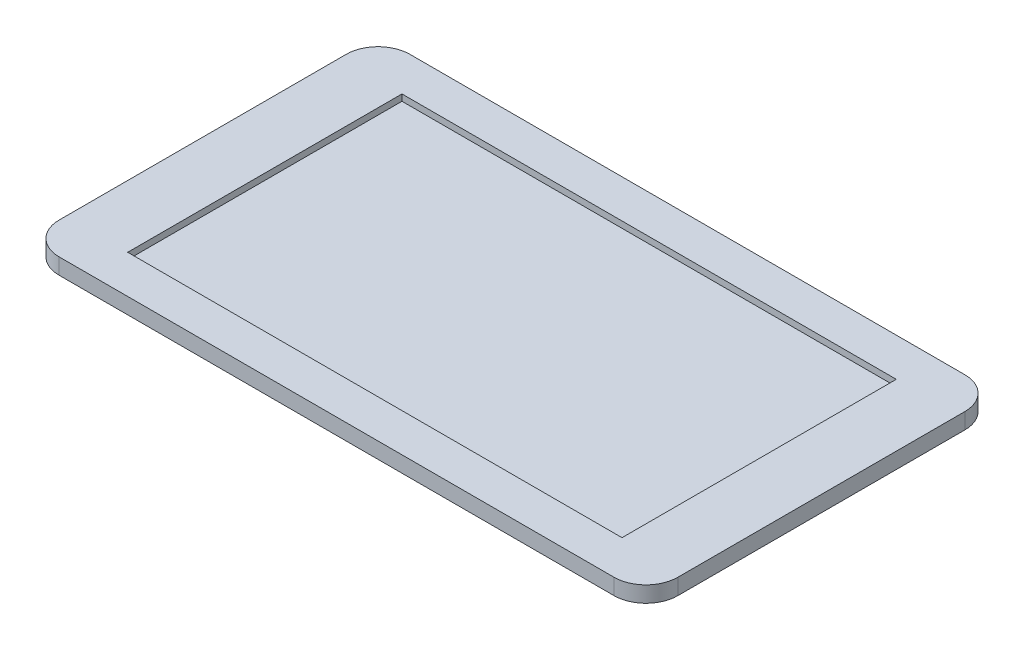
ISO-10303-21;
HEADER;
FILE_DESCRIPTION(('STEP AP214'),'2;1');
FILE_NAME('part.step','',(''),(''),'','','');
FILE_SCHEMA(('AUTOMOTIVE_DESIGN { 1 0 10303 214 1 1 1 1 }'));
ENDSEC;
DATA;
#1=APPLICATION_CONTEXT('core data for automotive mechanical design processes');
#2=APPLICATION_PROTOCOL_DEFINITION('international standard','automotive_design',2000,#1);
#3=PRODUCT_CONTEXT('',#1,'mechanical');
#4=PRODUCT('Part','Part','',(#3));
#5=PRODUCT_RELATED_PRODUCT_CATEGORY('part','',(#4));
#6=PRODUCT_DEFINITION_FORMATION('','',#4);
#7=PRODUCT_DEFINITION_CONTEXT('part definition',#1,'design');
#8=PRODUCT_DEFINITION('design','',#6,#7);
#9=PRODUCT_DEFINITION_SHAPE('','',#8);
#10=(LENGTH_UNIT() NAMED_UNIT(*) SI_UNIT(.MILLI.,.METRE.));
#11=(NAMED_UNIT(*) PLANE_ANGLE_UNIT() SI_UNIT($,.RADIAN.));
#12=(NAMED_UNIT(*) SI_UNIT($,.STERADIAN.) SOLID_ANGLE_UNIT());
#13=UNCERTAINTY_MEASURE_WITH_UNIT(LENGTH_MEASURE(1.E-05),#10,'distance_accuracy_value','');
#14=(GEOMETRIC_REPRESENTATION_CONTEXT(3) GLOBAL_UNCERTAINTY_ASSIGNED_CONTEXT((#13)) GLOBAL_UNIT_ASSIGNED_CONTEXT((#10,
#11,#12)) REPRESENTATION_CONTEXT('',''));
#15=CARTESIAN_POINT('',(0.,0.,0.));
#16=DIRECTION('',(0.,0.,1.));
#17=DIRECTION('',(1.,0.,0.));
#18=AXIS2_PLACEMENT_3D('',#15,#16,#17);
#19=CARTESIAN_POINT('',(97.,-5.,55.));
#20=DIRECTION('',(1.,0.,0.));
#21=DIRECTION('',(0.,0.,-1.));
#22=AXIS2_PLACEMENT_3D('',#19,#20,#21);
#23=PLANE('',#22);
#24=DIRECTION('',(0.,0.,-1.));
#25=VECTOR('',#24,1.);
#26=CARTESIAN_POINT('',(97.,0.,55.));
#27=LINE('',#26,#25);
#28=CARTESIAN_POINT('',(97.,0.,45.));
#29=VERTEX_POINT('',#28);
#30=CARTESIAN_POINT('',(97.,0.,-45.));
#31=VERTEX_POINT('',#30);
#32=EDGE_CURVE('E217',#29,#31,#27,.T.);
#33=ORIENTED_EDGE('',*,*,#32,.F.);
#34=DIRECTION('',(0.,1.,0.));
#35=VECTOR('',#34,1.);
#36=CARTESIAN_POINT('',(97.,-5.,45.));
#37=LINE('',#36,#35);
#38=CARTESIAN_POINT('',(97.,-5.,45.));
#39=VERTEX_POINT('',#38);
#40=EDGE_CURVE('E281',#29,#39,#37,.F.);
#41=ORIENTED_EDGE('',*,*,#40,.T.);
#42=DIRECTION('',(0.,0.,-1.));
#43=VECTOR('',#42,1.);
#44=CARTESIAN_POINT('',(97.,-5.,55.));
#45=LINE('',#44,#43);
#46=CARTESIAN_POINT('',(97.,-5.,-45.));
#47=VERTEX_POINT('',#46);
#48=EDGE_CURVE('E227',#39,#47,#45,.T.);
#49=ORIENTED_EDGE('',*,*,#48,.T.);
#50=DIRECTION('',(0.,1.,0.));
#51=VECTOR('',#50,1.);
#52=CARTESIAN_POINT('',(97.,-5.,-45.));
#53=LINE('',#52,#51);
#54=EDGE_CURVE('E277',#47,#31,#53,.T.);
#55=ORIENTED_EDGE('',*,*,#54,.T.);
#56=EDGE_LOOP('',(#33,#41,#49,#55));
#57=FACE_BOUND('',#56,.T.);
#58=ADVANCED_FACE('F39',(#57),#23,.T.);
#59=CARTESIAN_POINT('',(-97.,-5.,55.));
#60=DIRECTION('',(0.,0.,1.));
#61=DIRECTION('',(1.,0.,0.));
#62=AXIS2_PLACEMENT_3D('',#59,#60,#61);
#63=PLANE('',#62);
#64=DIRECTION('',(1.,0.,0.));
#65=VECTOR('',#64,1.);
#66=CARTESIAN_POINT('',(-97.,-5.,55.));
#67=LINE('',#66,#65);
#68=CARTESIAN_POINT('',(-87.,-5.,55.));
#69=VERTEX_POINT('',#68);
#70=CARTESIAN_POINT('',(87.,-5.,55.));
#71=VERTEX_POINT('',#70);
#72=EDGE_CURVE('E240',#69,#71,#67,.T.);
#73=ORIENTED_EDGE('',*,*,#72,.T.);
#74=DIRECTION('',(0.,1.,0.));
#75=VECTOR('',#74,1.);
#76=CARTESIAN_POINT('',(87.,-5.,55.));
#77=LINE('',#76,#75);
#78=CARTESIAN_POINT('',(87.,0.,55.));
#79=VERTEX_POINT('',#78);
#80=EDGE_CURVE('E261',#71,#79,#77,.T.);
#81=ORIENTED_EDGE('',*,*,#80,.T.);
#82=DIRECTION('',(1.,0.,0.));
#83=VECTOR('',#82,1.);
#84=CARTESIAN_POINT('',(-97.,0.,55.));
#85=LINE('',#84,#83);
#86=CARTESIAN_POINT('',(-87.,0.,55.));
#87=VERTEX_POINT('',#86);
#88=EDGE_CURVE('E232',#87,#79,#85,.T.);
#89=ORIENTED_EDGE('',*,*,#88,.F.);
#90=DIRECTION('',(0.,1.,0.));
#91=VECTOR('',#90,1.);
#92=CARTESIAN_POINT('',(-87.,-5.,55.));
#93=LINE('',#92,#91);
#94=EDGE_CURVE('E244',#87,#69,#93,.F.);
#95=ORIENTED_EDGE('',*,*,#94,.T.);
#96=EDGE_LOOP('',(#73,#81,#89,#95));
#97=FACE_BOUND('',#96,.T.);
#98=ADVANCED_FACE('F339',(#97),#63,.T.);
#99=CARTESIAN_POINT('',(-97.,-5.,55.));
#100=DIRECTION('',(-1.,0.,0.));
#101=DIRECTION('',(0.,0.,1.));
#102=AXIS2_PLACEMENT_3D('',#99,#100,#101);
#103=PLANE('',#102);
#104=DIRECTION('',(0.,0.,1.));
#105=VECTOR('',#104,1.);
#106=CARTESIAN_POINT('',(-97.,0.,55.));
#107=LINE('',#106,#105);
#108=CARTESIAN_POINT('',(-97.,0.,-45.));
#109=VERTEX_POINT('',#108);
#110=CARTESIAN_POINT('',(-97.,0.,45.));
#111=VERTEX_POINT('',#110);
#112=EDGE_CURVE('E252',#109,#111,#107,.T.);
#113=ORIENTED_EDGE('',*,*,#112,.F.);
#114=DIRECTION('',(0.,1.,0.));
#115=VECTOR('',#114,1.);
#116=CARTESIAN_POINT('',(-97.,-5.,-45.));
#117=LINE('',#116,#115);
#118=CARTESIAN_POINT('',(-97.,-5.,-45.));
#119=VERTEX_POINT('',#118);
#120=EDGE_CURVE('E11',#109,#119,#117,.F.);
#121=ORIENTED_EDGE('',*,*,#120,.T.);
#122=DIRECTION('',(0.,0.,1.));
#123=VECTOR('',#122,1.);
#124=CARTESIAN_POINT('',(-97.,-5.,55.));
#125=LINE('',#124,#123);
#126=CARTESIAN_POINT('',(-97.,-5.,45.));
#127=VERTEX_POINT('',#126);
#128=EDGE_CURVE('E236',#119,#127,#125,.T.);
#129=ORIENTED_EDGE('',*,*,#128,.T.);
#130=DIRECTION('',(0.,1.,0.));
#131=VECTOR('',#130,1.);
#132=CARTESIAN_POINT('',(-97.,-5.,45.));
#133=LINE('',#132,#131);
#134=EDGE_CURVE('E48',#127,#111,#133,.T.);
#135=ORIENTED_EDGE('',*,*,#134,.T.);
#136=EDGE_LOOP('',(#113,#121,#129,#135));
#137=FACE_BOUND('',#136,.T.);
#138=ADVANCED_FACE('F307',(#137),#103,.T.);
#139=CARTESIAN_POINT('',(-97.,-5.,-55.));
#140=DIRECTION('',(0.,0.,-1.));
#141=DIRECTION('',(-1.,0.,0.));
#142=AXIS2_PLACEMENT_3D('',#139,#140,#141);
#143=PLANE('',#142);
#144=DIRECTION('',(-1.,0.,0.));
#145=VECTOR('',#144,1.);
#146=CARTESIAN_POINT('',(-97.,0.,-55.));
#147=LINE('',#146,#145);
#148=CARTESIAN_POINT('',(87.,0.,-55.));
#149=VERTEX_POINT('',#148);
#150=CARTESIAN_POINT('',(-87.,0.,-55.));
#151=VERTEX_POINT('',#150);
#152=EDGE_CURVE('E248',#149,#151,#147,.T.);
#153=ORIENTED_EDGE('',*,*,#152,.F.);
#154=DIRECTION('',(0.,1.,0.));
#155=VECTOR('',#154,1.);
#156=CARTESIAN_POINT('',(87.,-5.,-55.));
#157=LINE('',#156,#155);
#158=CARTESIAN_POINT('',(87.,-5.,-55.));
#159=VERTEX_POINT('',#158);
#160=EDGE_CURVE('E300',#149,#159,#157,.F.);
#161=ORIENTED_EDGE('',*,*,#160,.T.);
#162=DIRECTION('',(-1.,0.,0.));
#163=VECTOR('',#162,1.);
#164=CARTESIAN_POINT('',(-97.,-5.,-55.));
#165=LINE('',#164,#163);
#166=CARTESIAN_POINT('',(-87.,-5.,-55.));
#167=VERTEX_POINT('',#166);
#168=EDGE_CURVE('E231',#159,#167,#165,.T.);
#169=ORIENTED_EDGE('',*,*,#168,.T.);
#170=DIRECTION('',(0.,1.,0.));
#171=VECTOR('',#170,1.);
#172=CARTESIAN_POINT('',(-87.,-5.,-55.));
#173=LINE('',#172,#171);
#174=EDGE_CURVE('E296',#167,#151,#173,.T.);
#175=ORIENTED_EDGE('',*,*,#174,.T.);
#176=EDGE_LOOP('',(#153,#161,#169,#175));
#177=FACE_BOUND('',#176,.T.);
#178=ADVANCED_FACE('F321',(#177),#143,.T.);
#179=CARTESIAN_POINT('',(0.,-5.,0.));
#180=DIRECTION('',(0.,-1.,0.));
#181=DIRECTION('',(0.,0.,-1.));
#182=AXIS2_PLACEMENT_3D('',#179,#180,#181);
#183=PLANE('',#182);
#184=DIRECTION('',(0.,0.,1.));
#185=VECTOR('',#184,1.);
#186=CARTESIAN_POINT('',(33.875,-5.,-29.375));
#187=LINE('',#186,#185);
#188=CARTESIAN_POINT('',(33.875,-5.,-29.375));
#189=VERTEX_POINT('',#188);
#190=CARTESIAN_POINT('',(33.875,-5.,29.375));
#191=VERTEX_POINT('',#190);
#192=EDGE_CURVE('E55',#189,#191,#187,.T.);
#193=ORIENTED_EDGE('',*,*,#192,.F.);
#194=DIRECTION('',(1.,0.,0.));
#195=VECTOR('',#194,1.);
#196=CARTESIAN_POINT('',(-33.875,-5.,-29.375));
#197=LINE('',#196,#195);
#198=CARTESIAN_POINT('',(-33.875,-5.,-29.375));
#199=VERTEX_POINT('',#198);
#200=EDGE_CURVE('E59',#199,#189,#197,.T.);
#201=ORIENTED_EDGE('',*,*,#200,.F.);
#202=DIRECTION('',(0.,0.,-1.));
#203=VECTOR('',#202,1.);
#204=CARTESIAN_POINT('',(-33.875,-5.,-29.375));
#205=LINE('',#204,#203);
#206=CARTESIAN_POINT('',(-33.875,-5.,29.375));
#207=VERTEX_POINT('',#206);
#208=EDGE_CURVE('E632',#207,#199,#205,.T.);
#209=ORIENTED_EDGE('',*,*,#208,.F.);
#210=DIRECTION('',(-1.,0.,0.));
#211=VECTOR('',#210,1.);
#212=CARTESIAN_POINT('',(-33.875,-5.,29.375));
#213=LINE('',#212,#211);
#214=EDGE_CURVE('E629',#191,#207,#213,.T.);
#215=ORIENTED_EDGE('',*,*,#214,.F.);
#216=EDGE_LOOP('',(#193,#201,#209,#215));
#217=FACE_BOUND('',#216,.T.);
#218=ORIENTED_EDGE('',*,*,#48,.F.);
#219=CARTESIAN_POINT('',(87.,-5.,45.));
#220=DIRECTION('',(0.,-1.,0.));
#221=DIRECTION('',(0.,0.,-1.));
#222=AXIS2_PLACEMENT_3D('',#219,#220,#221);
#223=CIRCLE('',#222,10.);
#224=EDGE_CURVE('E293',#39,#71,#223,.T.);
#225=ORIENTED_EDGE('',*,*,#224,.T.);
#226=ORIENTED_EDGE('',*,*,#72,.F.);
#227=CARTESIAN_POINT('',(-87.,-5.,45.));
#228=DIRECTION('',(0.,-1.,0.));
#229=DIRECTION('',(0.,0.,-1.));
#230=AXIS2_PLACEMENT_3D('',#227,#228,#229);
#231=CIRCLE('',#230,10.);
#232=EDGE_CURVE('E284',#69,#127,#231,.T.);
#233=ORIENTED_EDGE('',*,*,#232,.T.);
#234=ORIENTED_EDGE('',*,*,#128,.F.);
#235=CARTESIAN_POINT('',(-87.,-5.,-45.));
#236=DIRECTION('',(0.,-1.,0.));
#237=DIRECTION('',(0.,0.,-1.));
#238=AXIS2_PLACEMENT_3D('',#235,#236,#237);
#239=CIRCLE('',#238,10.);
#240=EDGE_CURVE('E287',#119,#167,#239,.T.);
#241=ORIENTED_EDGE('',*,*,#240,.T.);
#242=ORIENTED_EDGE('',*,*,#168,.F.);
#243=CARTESIAN_POINT('',(87.,-5.,-45.));
#244=DIRECTION('',(0.,-1.,0.));
#245=DIRECTION('',(0.,0.,-1.));
#246=AXIS2_PLACEMENT_3D('',#243,#244,#245);
#247=CIRCLE('',#246,10.);
#248=EDGE_CURVE('E290',#159,#47,#247,.T.);
#249=ORIENTED_EDGE('',*,*,#248,.T.);
#250=EDGE_LOOP('',(#218,#225,#226,#233,#234,#241,#242,#249));
#251=FACE_BOUND('',#250,.T.);
#252=ADVANCED_FACE('F327',(#217,#251),#183,.T.);
#253=CARTESIAN_POINT('',(0.,0.,0.));
#254=DIRECTION('',(0.,-1.,0.));
#255=DIRECTION('',(0.,0.,-1.));
#256=AXIS2_PLACEMENT_3D('',#253,#254,#255);
#257=PLANE('',#256);
#258=DIRECTION('',(-1.,0.,0.));
#259=VECTOR('',#258,1.);
#260=CARTESIAN_POINT('',(-77.5,0.,-43.));
#261=LINE('',#260,#259);
#262=CARTESIAN_POINT('',(77.5,0.,-43.));
#263=VERTEX_POINT('',#262);
#264=CARTESIAN_POINT('',(-77.5,0.,-43.));
#265=VERTEX_POINT('',#264);
#266=EDGE_CURVE('E180',#263,#265,#261,.T.);
#267=ORIENTED_EDGE('',*,*,#266,.F.);
#268=DIRECTION('',(0.,0.,-1.));
#269=VECTOR('',#268,1.);
#270=CARTESIAN_POINT('',(77.5,0.,43.));
#271=LINE('',#270,#269);
#272=CARTESIAN_POINT('',(77.5,0.,43.));
#273=VERTEX_POINT('',#272);
#274=EDGE_CURVE('E176',#273,#263,#271,.T.);
#275=ORIENTED_EDGE('',*,*,#274,.F.);
#276=DIRECTION('',(1.,0.,0.));
#277=VECTOR('',#276,1.);
#278=CARTESIAN_POINT('',(-77.5,0.,43.));
#279=LINE('',#278,#277);
#280=CARTESIAN_POINT('',(-77.5,0.,43.));
#281=VERTEX_POINT('',#280);
#282=EDGE_CURVE('E191',#281,#273,#279,.T.);
#283=ORIENTED_EDGE('',*,*,#282,.F.);
#284=DIRECTION('',(0.,0.,1.));
#285=VECTOR('',#284,1.);
#286=CARTESIAN_POINT('',(-77.5,0.,43.));
#287=LINE('',#286,#285);
#288=EDGE_CURVE('E207',#265,#281,#287,.T.);
#289=ORIENTED_EDGE('',*,*,#288,.F.);
#290=EDGE_LOOP('',(#267,#275,#283,#289));
#291=FACE_BOUND('',#290,.T.);
#292=ORIENTED_EDGE('',*,*,#88,.T.);
#293=CARTESIAN_POINT('',(87.,0.,45.));
#294=DIRECTION('',(0.,-1.,0.));
#295=DIRECTION('',(0.,0.,-1.));
#296=AXIS2_PLACEMENT_3D('',#293,#294,#295);
#297=CIRCLE('',#296,10.);
#298=EDGE_CURVE('E274',#79,#29,#297,.F.);
#299=ORIENTED_EDGE('',*,*,#298,.T.);
#300=ORIENTED_EDGE('',*,*,#32,.T.);
#301=CARTESIAN_POINT('',(87.,0.,-45.));
#302=DIRECTION('',(0.,-1.,0.));
#303=DIRECTION('',(0.,0.,-1.));
#304=AXIS2_PLACEMENT_3D('',#301,#302,#303);
#305=CIRCLE('',#304,10.);
#306=EDGE_CURVE('E271',#31,#149,#305,.F.);
#307=ORIENTED_EDGE('',*,*,#306,.T.);
#308=ORIENTED_EDGE('',*,*,#152,.T.);
#309=CARTESIAN_POINT('',(-87.,0.,-45.));
#310=DIRECTION('',(0.,-1.,0.));
#311=DIRECTION('',(0.,0.,-1.));
#312=AXIS2_PLACEMENT_3D('',#309,#310,#311);
#313=CIRCLE('',#312,10.);
#314=EDGE_CURVE('E268',#151,#109,#313,.F.);
#315=ORIENTED_EDGE('',*,*,#314,.T.);
#316=ORIENTED_EDGE('',*,*,#112,.T.);
#317=CARTESIAN_POINT('',(-87.,0.,45.));
#318=DIRECTION('',(0.,-1.,0.));
#319=DIRECTION('',(0.,0.,-1.));
#320=AXIS2_PLACEMENT_3D('',#317,#318,#319);
#321=CIRCLE('',#320,10.);
#322=EDGE_CURVE('E265',#111,#87,#321,.F.);
#323=ORIENTED_EDGE('',*,*,#322,.T.);
#324=EDGE_LOOP('',(#292,#299,#300,#307,#308,#315,#316,#323));
#325=FACE_BOUND('',#324,.T.);
#326=ADVANCED_FACE('F313',(#291,#325),#257,.F.);
#327=CARTESIAN_POINT('',(87.,-5.,45.));
#328=DIRECTION('',(0.,1.,0.));
#329=DIRECTION('',(0.,0.,1.));
#330=AXIS2_PLACEMENT_3D('',#327,#328,#329);
#331=CYLINDRICAL_SURFACE('',#330,10.);
#332=ORIENTED_EDGE('',*,*,#224,.F.);
#333=ORIENTED_EDGE('',*,*,#40,.F.);
#334=ORIENTED_EDGE('',*,*,#298,.F.);
#335=ORIENTED_EDGE('',*,*,#80,.F.);
#336=EDGE_LOOP('',(#332,#333,#334,#335));
#337=FACE_BOUND('',#336,.T.);
#338=ADVANCED_FACE('F337',(#337),#331,.T.);
#339=CARTESIAN_POINT('',(87.,-5.,-45.));
#340=DIRECTION('',(0.,1.,0.));
#341=DIRECTION('',(0.,0.,1.));
#342=AXIS2_PLACEMENT_3D('',#339,#340,#341);
#343=CYLINDRICAL_SURFACE('',#342,10.);
#344=ORIENTED_EDGE('',*,*,#248,.F.);
#345=ORIENTED_EDGE('',*,*,#160,.F.);
#346=ORIENTED_EDGE('',*,*,#306,.F.);
#347=ORIENTED_EDGE('',*,*,#54,.F.);
#348=EDGE_LOOP('',(#344,#345,#346,#347));
#349=FACE_BOUND('',#348,.T.);
#350=ADVANCED_FACE('F330',(#349),#343,.T.);
#351=CARTESIAN_POINT('',(-87.,-5.,-45.));
#352=DIRECTION('',(0.,1.,0.));
#353=DIRECTION('',(0.,0.,1.));
#354=AXIS2_PLACEMENT_3D('',#351,#352,#353);
#355=CYLINDRICAL_SURFACE('',#354,10.);
#356=ORIENTED_EDGE('',*,*,#240,.F.);
#357=ORIENTED_EDGE('',*,*,#120,.F.);
#358=ORIENTED_EDGE('',*,*,#314,.F.);
#359=ORIENTED_EDGE('',*,*,#174,.F.);
#360=EDGE_LOOP('',(#356,#357,#358,#359));
#361=FACE_BOUND('',#360,.T.);
#362=ADVANCED_FACE('F319',(#361),#355,.T.);
#363=CARTESIAN_POINT('',(-87.,-5.,45.));
#364=DIRECTION('',(0.,1.,0.));
#365=DIRECTION('',(0.,0.,1.));
#366=AXIS2_PLACEMENT_3D('',#363,#364,#365);
#367=CYLINDRICAL_SURFACE('',#366,10.);
#368=ORIENTED_EDGE('',*,*,#232,.F.);
#369=ORIENTED_EDGE('',*,*,#94,.F.);
#370=ORIENTED_EDGE('',*,*,#322,.F.);
#371=ORIENTED_EDGE('',*,*,#134,.F.);
#372=EDGE_LOOP('',(#368,#369,#370,#371));
#373=FACE_BOUND('',#372,.T.);
#374=ADVANCED_FACE('F41',(#373),#367,.T.);
#375=CARTESIAN_POINT('',(77.5,-2.,43.));
#376=DIRECTION('',(1.,0.,0.));
#377=DIRECTION('',(0.,0.,-1.));
#378=AXIS2_PLACEMENT_3D('',#375,#376,#377);
#379=PLANE('',#378);
#380=ORIENTED_EDGE('',*,*,#274,.T.);
#381=DIRECTION('',(0.,1.,0.));
#382=VECTOR('',#381,1.);
#383=CARTESIAN_POINT('',(77.5,-2.,-43.));
#384=LINE('',#383,#382);
#385=CARTESIAN_POINT('',(77.5,-2.,-43.));
#386=VERTEX_POINT('',#385);
#387=EDGE_CURVE('E202',#386,#263,#384,.T.);
#388=ORIENTED_EDGE('',*,*,#387,.F.);
#389=DIRECTION('',(0.,0.,-1.));
#390=VECTOR('',#389,1.);
#391=CARTESIAN_POINT('',(77.5,-2.,43.));
#392=LINE('',#391,#390);
#393=CARTESIAN_POINT('',(77.5,-2.,43.));
#394=VERTEX_POINT('',#393);
#395=EDGE_CURVE('E186',#394,#386,#392,.T.);
#396=ORIENTED_EDGE('',*,*,#395,.F.);
#397=DIRECTION('',(0.,1.,0.));
#398=VECTOR('',#397,1.);
#399=CARTESIAN_POINT('',(77.5,-2.,43.));
#400=LINE('',#399,#398);
#401=EDGE_CURVE('E214',#394,#273,#400,.T.);
#402=ORIENTED_EDGE('',*,*,#401,.T.);
#403=EDGE_LOOP('',(#380,#388,#396,#402));
#404=FACE_BOUND('',#403,.T.);
#405=ADVANCED_FACE('F343',(#404),#379,.F.);
#406=CARTESIAN_POINT('',(-77.5,-2.,43.));
#407=DIRECTION('',(0.,0.,1.));
#408=DIRECTION('',(1.,0.,0.));
#409=AXIS2_PLACEMENT_3D('',#406,#407,#408);
#410=PLANE('',#409);
#411=ORIENTED_EDGE('',*,*,#282,.T.);
#412=ORIENTED_EDGE('',*,*,#401,.F.);
#413=DIRECTION('',(1.,0.,0.));
#414=VECTOR('',#413,1.);
#415=CARTESIAN_POINT('',(-77.5,-2.,43.));
#416=LINE('',#415,#414);
#417=CARTESIAN_POINT('',(-77.5,-2.,43.));
#418=VERTEX_POINT('',#417);
#419=EDGE_CURVE('E199',#418,#394,#416,.T.);
#420=ORIENTED_EDGE('',*,*,#419,.F.);
#421=DIRECTION('',(0.,1.,0.));
#422=VECTOR('',#421,1.);
#423=CARTESIAN_POINT('',(-77.5,-2.,43.));
#424=LINE('',#423,#422);
#425=EDGE_CURVE('E218',#418,#281,#424,.T.);
#426=ORIENTED_EDGE('',*,*,#425,.T.);
#427=EDGE_LOOP('',(#411,#412,#420,#426));
#428=FACE_BOUND('',#427,.T.);
#429=ADVANCED_FACE('F348',(#428),#410,.F.);
#430=CARTESIAN_POINT('',(-77.5,-2.,43.));
#431=DIRECTION('',(-1.,0.,0.));
#432=DIRECTION('',(0.,0.,1.));
#433=AXIS2_PLACEMENT_3D('',#430,#431,#432);
#434=PLANE('',#433);
#435=ORIENTED_EDGE('',*,*,#288,.T.);
#436=ORIENTED_EDGE('',*,*,#425,.F.);
#437=DIRECTION('',(0.,0.,1.));
#438=VECTOR('',#437,1.);
#439=CARTESIAN_POINT('',(-77.5,-2.,43.));
#440=LINE('',#439,#438);
#441=CARTESIAN_POINT('',(-77.5,-2.,-43.));
#442=VERTEX_POINT('',#441);
#443=EDGE_CURVE('E195',#442,#418,#440,.T.);
#444=ORIENTED_EDGE('',*,*,#443,.F.);
#445=DIRECTION('',(0.,1.,0.));
#446=VECTOR('',#445,1.);
#447=CARTESIAN_POINT('',(-77.5,-2.,-43.));
#448=LINE('',#447,#446);
#449=EDGE_CURVE('E221',#442,#265,#448,.T.);
#450=ORIENTED_EDGE('',*,*,#449,.T.);
#451=EDGE_LOOP('',(#435,#436,#444,#450));
#452=FACE_BOUND('',#451,.T.);
#453=ADVANCED_FACE('F398',(#452),#434,.F.);
#454=CARTESIAN_POINT('',(-77.5,-2.,-43.));
#455=DIRECTION('',(0.,0.,-1.));
#456=DIRECTION('',(-1.,0.,0.));
#457=AXIS2_PLACEMENT_3D('',#454,#455,#456);
#458=PLANE('',#457);
#459=ORIENTED_EDGE('',*,*,#266,.T.);
#460=ORIENTED_EDGE('',*,*,#449,.F.);
#461=DIRECTION('',(-1.,0.,0.));
#462=VECTOR('',#461,1.);
#463=CARTESIAN_POINT('',(-77.5,-2.,-43.));
#464=LINE('',#463,#462);
#465=EDGE_CURVE('E190',#386,#442,#464,.T.);
#466=ORIENTED_EDGE('',*,*,#465,.F.);
#467=ORIENTED_EDGE('',*,*,#387,.T.);
#468=EDGE_LOOP('',(#459,#460,#466,#467));
#469=FACE_BOUND('',#468,.T.);
#470=ADVANCED_FACE('F408',(#469),#458,.F.);
#471=CARTESIAN_POINT('',(0.,-2.,0.));
#472=DIRECTION('',(0.,-1.,0.));
#473=DIRECTION('',(0.,0.,-1.));
#474=AXIS2_PLACEMENT_3D('',#471,#472,#473);
#475=PLANE('',#474);
#476=ORIENTED_EDGE('',*,*,#395,.T.);
#477=ORIENTED_EDGE('',*,*,#465,.T.);
#478=ORIENTED_EDGE('',*,*,#443,.T.);
#479=ORIENTED_EDGE('',*,*,#419,.T.);
#480=EDGE_LOOP('',(#476,#477,#478,#479));
#481=FACE_BOUND('',#480,.T.);
#482=ADVANCED_FACE('F418',(#481),#475,.F.);
#483=CARTESIAN_POINT('',(0.,-10.,0.));
#484=DIRECTION('',(0.,1.,0.));
#485=DIRECTION('',(0.,0.,1.));
#486=AXIS2_PLACEMENT_3D('',#483,#484,#485);
#487=PLANE('',#486);
#488=DIRECTION('',(0.,0.,1.));
#489=VECTOR('',#488,1.);
#490=CARTESIAN_POINT('',(33.875,-10.,-29.375));
#491=LINE('',#490,#489);
#492=CARTESIAN_POINT('',(33.875,-10.,-29.375));
#493=VERTEX_POINT('',#492);
#494=CARTESIAN_POINT('',(33.875,-10.,29.375));
#495=VERTEX_POINT('',#494);
#496=EDGE_CURVE('E162',#493,#495,#491,.T.);
#497=ORIENTED_EDGE('',*,*,#496,.T.);
#498=DIRECTION('',(-1.,0.,0.));
#499=VECTOR('',#498,1.);
#500=CARTESIAN_POINT('',(-33.875,-10.,29.375));
#501=LINE('',#500,#499);
#502=CARTESIAN_POINT('',(-33.875,-10.,29.375));
#503=VERTEX_POINT('',#502);
#504=EDGE_CURVE('E150',#495,#503,#501,.T.);
#505=ORIENTED_EDGE('',*,*,#504,.T.);
#506=DIRECTION('',(0.,0.,-1.));
#507=VECTOR('',#506,1.);
#508=CARTESIAN_POINT('',(-33.875,-10.,-29.375));
#509=LINE('',#508,#507);
#510=CARTESIAN_POINT('',(-33.875,-10.,-29.375));
#511=VERTEX_POINT('',#510);
#512=EDGE_CURVE('E161',#503,#511,#509,.T.);
#513=ORIENTED_EDGE('',*,*,#512,.T.);
#514=DIRECTION('',(1.,0.,0.));
#515=VECTOR('',#514,1.);
#516=CARTESIAN_POINT('',(-33.875,-10.,-29.375));
#517=LINE('',#516,#515);
#518=EDGE_CURVE('E168',#511,#493,#517,.T.);
#519=ORIENTED_EDGE('',*,*,#518,.T.);
#520=EDGE_LOOP('',(#497,#505,#513,#519));
#521=FACE_BOUND('',#520,.T.);
#522=CARTESIAN_POINT('',(-29.,-10.,24.5));
#523=DIRECTION('',(0.,-1.,0.));
#524=DIRECTION('',(0.,0.,-1.));
#525=AXIS2_PLACEMENT_3D('',#522,#523,#524);
#526=CIRCLE('',#525,1.375);
#527=CARTESIAN_POINT('',(-29.,-10.,23.125));
#528=VERTEX_POINT('',#527);
#529=EDGE_CURVE('E615',#528,#528,#526,.T.);
#530=ORIENTED_EDGE('',*,*,#529,.F.);
#531=EDGE_LOOP('',(#530));
#532=FACE_BOUND('',#531,.T.);
#533=CARTESIAN_POINT('',(29.,-10.,24.5));
#534=DIRECTION('',(0.,-1.,0.));
#535=DIRECTION('',(0.,0.,-1.));
#536=AXIS2_PLACEMENT_3D('',#533,#534,#535);
#537=CIRCLE('',#536,1.375);
#538=CARTESIAN_POINT('',(29.,-10.,23.125));
#539=VERTEX_POINT('',#538);
#540=EDGE_CURVE('E607',#539,#539,#537,.T.);
#541=ORIENTED_EDGE('',*,*,#540,.F.);
#542=EDGE_LOOP('',(#541));
#543=FACE_BOUND('',#542,.T.);
#544=CARTESIAN_POINT('',(29.,-10.,-24.5));
#545=DIRECTION('',(0.,-1.,0.));
#546=DIRECTION('',(0.,0.,-1.));
#547=AXIS2_PLACEMENT_3D('',#544,#545,#546);
#548=CIRCLE('',#547,1.375);
#549=CARTESIAN_POINT('',(29.,-10.,-25.875));
#550=VERTEX_POINT('',#549);
#551=EDGE_CURVE('E599',#550,#550,#548,.T.);
#552=ORIENTED_EDGE('',*,*,#551,.F.);
#553=EDGE_LOOP('',(#552));
#554=FACE_BOUND('',#553,.T.);
#555=CARTESIAN_POINT('',(-29.,-10.,-24.5));
#556=DIRECTION('',(0.,-1.,0.));
#557=DIRECTION('',(0.,0.,-1.));
#558=AXIS2_PLACEMENT_3D('',#555,#556,#557);
#559=CIRCLE('',#558,1.375);
#560=CARTESIAN_POINT('',(-29.,-10.,-25.875));
#561=VERTEX_POINT('',#560);
#562=EDGE_CURVE('E592',#561,#561,#559,.T.);
#563=ORIENTED_EDGE('',*,*,#562,.F.);
#564=EDGE_LOOP('',(#563));
#565=FACE_BOUND('',#564,.T.);
#566=ADVANCED_FACE('F165',(#521,#532,#543,#554,#565),#487,.F.);
#567=CARTESIAN_POINT('',(33.875,-10.,-29.375));
#568=DIRECTION('',(-1.,0.,0.));
#569=DIRECTION('',(0.,0.,1.));
#570=AXIS2_PLACEMENT_3D('',#567,#568,#569);
#571=PLANE('',#570);
#572=ORIENTED_EDGE('',*,*,#192,.T.);
#573=DIRECTION('',(0.,1.,0.));
#574=VECTOR('',#573,1.);
#575=CARTESIAN_POINT('',(33.875,-10.,29.375));
#576=LINE('',#575,#574);
#577=EDGE_CURVE('E155',#495,#191,#576,.T.);
#578=ORIENTED_EDGE('',*,*,#577,.F.);
#579=ORIENTED_EDGE('',*,*,#496,.F.);
#580=DIRECTION('',(0.,1.,0.));
#581=VECTOR('',#580,1.);
#582=CARTESIAN_POINT('',(33.875,-10.,-29.375));
#583=LINE('',#582,#581);
#584=EDGE_CURVE('E626',#493,#189,#583,.T.);
#585=ORIENTED_EDGE('',*,*,#584,.T.);
#586=EDGE_LOOP('',(#572,#578,#579,#585));
#587=FACE_BOUND('',#586,.T.);
#588=ADVANCED_FACE('F174',(#587),#571,.F.);
#589=CARTESIAN_POINT('',(-33.875,-10.,29.375));
#590=DIRECTION('',(0.,0.,-1.));
#591=DIRECTION('',(-1.,0.,0.));
#592=AXIS2_PLACEMENT_3D('',#589,#590,#591);
#593=PLANE('',#592);
#594=ORIENTED_EDGE('',*,*,#214,.T.);
#595=DIRECTION('',(0.,1.,0.));
#596=VECTOR('',#595,1.);
#597=CARTESIAN_POINT('',(-33.875,-10.,29.375));
#598=LINE('',#597,#596);
#599=EDGE_CURVE('E157',#503,#207,#598,.T.);
#600=ORIENTED_EDGE('',*,*,#599,.F.);
#601=ORIENTED_EDGE('',*,*,#504,.F.);
#602=ORIENTED_EDGE('',*,*,#577,.T.);
#603=EDGE_LOOP('',(#594,#600,#601,#602));
#604=FACE_BOUND('',#603,.T.);
#605=ADVANCED_FACE('F153',(#604),#593,.F.);
#606=CARTESIAN_POINT('',(-33.875,-10.,-29.375));
#607=DIRECTION('',(1.,0.,0.));
#608=DIRECTION('',(0.,0.,-1.));
#609=AXIS2_PLACEMENT_3D('',#606,#607,#608);
#610=PLANE('',#609);
#611=ORIENTED_EDGE('',*,*,#208,.T.);
#612=DIRECTION('',(0.,1.,0.));
#613=VECTOR('',#612,1.);
#614=CARTESIAN_POINT('',(-33.875,-10.,-29.375));
#615=LINE('',#614,#613);
#616=EDGE_CURVE('E182',#511,#199,#615,.T.);
#617=ORIENTED_EDGE('',*,*,#616,.F.);
#618=ORIENTED_EDGE('',*,*,#512,.F.);
#619=ORIENTED_EDGE('',*,*,#599,.T.);
#620=EDGE_LOOP('',(#611,#617,#618,#619));
#621=FACE_BOUND('',#620,.T.);
#622=ADVANCED_FACE('F465',(#621),#610,.F.);
#623=CARTESIAN_POINT('',(-33.875,-10.,-29.375));
#624=DIRECTION('',(0.,0.,1.));
#625=DIRECTION('',(1.,0.,0.));
#626=AXIS2_PLACEMENT_3D('',#623,#624,#625);
#627=PLANE('',#626);
#628=ORIENTED_EDGE('',*,*,#200,.T.);
#629=ORIENTED_EDGE('',*,*,#584,.F.);
#630=ORIENTED_EDGE('',*,*,#518,.F.);
#631=ORIENTED_EDGE('',*,*,#616,.T.);
#632=EDGE_LOOP('',(#628,#629,#630,#631));
#633=FACE_BOUND('',#632,.T.);
#634=ADVANCED_FACE('F474',(#633),#627,.F.);
#635=CARTESIAN_POINT('',(-29.,-10.,24.5));
#636=DIRECTION('',(0.,1.,0.));
#637=DIRECTION('',(0.,0.,1.));
#638=AXIS2_PLACEMENT_3D('',#635,#636,#637);
#639=CYLINDRICAL_SURFACE('',#638,1.375);
#640=ORIENTED_EDGE('',*,*,#529,.T.);
#641=EDGE_LOOP('',(#640));
#642=FACE_BOUND('',#641,.T.);
#643=CARTESIAN_POINT('',(-29.,-5.,24.5));
#644=DIRECTION('',(0.,-1.,0.));
#645=DIRECTION('',(0.,0.,-1.));
#646=AXIS2_PLACEMENT_3D('',#643,#644,#645);
#647=CIRCLE('',#646,1.375);
#648=CARTESIAN_POINT('',(-29.,-5.,23.125));
#649=VERTEX_POINT('',#648);
#650=EDGE_CURVE('E611',#649,#649,#647,.T.);
#651=ORIENTED_EDGE('',*,*,#650,.F.);
#652=EDGE_LOOP('',(#651));
#653=FACE_BOUND('',#652,.T.);
#654=ADVANCED_FACE('F484',(#642,#653),#639,.F.);
#655=CARTESIAN_POINT('',(29.,-10.,24.5));
#656=DIRECTION('',(0.,1.,0.));
#657=DIRECTION('',(0.,0.,1.));
#658=AXIS2_PLACEMENT_3D('',#655,#656,#657);
#659=CYLINDRICAL_SURFACE('',#658,1.375);
#660=ORIENTED_EDGE('',*,*,#540,.T.);
#661=EDGE_LOOP('',(#660));
#662=FACE_BOUND('',#661,.T.);
#663=CARTESIAN_POINT('',(29.,-5.,24.5));
#664=DIRECTION('',(0.,-1.,0.));
#665=DIRECTION('',(0.,0.,-1.));
#666=AXIS2_PLACEMENT_3D('',#663,#664,#665);
#667=CIRCLE('',#666,1.375);
#668=CARTESIAN_POINT('',(29.,-5.,23.125));
#669=VERTEX_POINT('',#668);
#670=EDGE_CURVE('E603',#669,#669,#667,.T.);
#671=ORIENTED_EDGE('',*,*,#670,.F.);
#672=EDGE_LOOP('',(#671));
#673=FACE_BOUND('',#672,.T.);
#674=ADVANCED_FACE('F494',(#662,#673),#659,.F.);
#675=CARTESIAN_POINT('',(29.,-10.,-24.5));
#676=DIRECTION('',(0.,1.,0.));
#677=DIRECTION('',(0.,0.,1.));
#678=AXIS2_PLACEMENT_3D('',#675,#676,#677);
#679=CYLINDRICAL_SURFACE('',#678,1.375);
#680=ORIENTED_EDGE('',*,*,#551,.T.);
#681=EDGE_LOOP('',(#680));
#682=FACE_BOUND('',#681,.T.);
#683=CARTESIAN_POINT('',(29.,-5.,-24.5));
#684=DIRECTION('',(0.,-1.,0.));
#685=DIRECTION('',(0.,0.,-1.));
#686=AXIS2_PLACEMENT_3D('',#683,#684,#685);
#687=CIRCLE('',#686,1.375);
#688=CARTESIAN_POINT('',(29.,-5.,-25.875));
#689=VERTEX_POINT('',#688);
#690=EDGE_CURVE('E596',#689,#689,#687,.T.);
#691=ORIENTED_EDGE('',*,*,#690,.F.);
#692=EDGE_LOOP('',(#691));
#693=FACE_BOUND('',#692,.T.);
#694=ADVANCED_FACE('F504',(#682,#693),#679,.F.);
#695=CARTESIAN_POINT('',(-29.,-10.,-24.5));
#696=DIRECTION('',(0.,1.,0.));
#697=DIRECTION('',(0.,0.,1.));
#698=AXIS2_PLACEMENT_3D('',#695,#696,#697);
#699=CYLINDRICAL_SURFACE('',#698,1.375);
#700=ORIENTED_EDGE('',*,*,#562,.T.);
#701=EDGE_LOOP('',(#700));
#702=FACE_BOUND('',#701,.T.);
#703=CARTESIAN_POINT('',(-29.,-5.,-24.5));
#704=DIRECTION('',(0.,-1.,0.));
#705=DIRECTION('',(0.,0.,-1.));
#706=AXIS2_PLACEMENT_3D('',#703,#704,#705);
#707=CIRCLE('',#706,1.375);
#708=CARTESIAN_POINT('',(-29.,-5.,-25.875));
#709=VERTEX_POINT('',#708);
#710=EDGE_CURVE('E589',#709,#709,#707,.T.);
#711=ORIENTED_EDGE('',*,*,#710,.F.);
#712=EDGE_LOOP('',(#711));
#713=FACE_BOUND('',#712,.T.);
#714=ADVANCED_FACE('F514',(#702,#713),#699,.F.);
#715=ORIENTED_EDGE('',*,*,#670,.T.);
#716=EDGE_LOOP('',(#715));
#717=FACE_BOUND('',#716,.T.);
#718=ADVANCED_FACE('F524',(#717),#183,.T.);
#719=ORIENTED_EDGE('',*,*,#650,.T.);
#720=EDGE_LOOP('',(#719));
#721=FACE_BOUND('',#720,.T.);
#722=ADVANCED_FACE('F533',(#721),#183,.T.);
#723=ORIENTED_EDGE('',*,*,#690,.T.);
#724=EDGE_LOOP('',(#723));
#725=FACE_BOUND('',#724,.T.);
#726=ADVANCED_FACE('F438',(#725),#183,.T.);
#727=ORIENTED_EDGE('',*,*,#710,.T.);
#728=EDGE_LOOP('',(#727));
#729=FACE_BOUND('',#728,.T.);
#730=ADVANCED_FACE('F439',(#729),#183,.T.);
#731=CLOSED_SHELL('',(#58,#98,#138,#178,#252,#326,#338,#350,#362,#374,#405,#429,#453,#470,#482,
#566,#588,#605,#622,#634,#654,#674,#694,#714,#718,#722,#726,#730));
#732=MANIFOLD_SOLID_BREP('B2',#731);
#733=ADVANCED_BREP_SHAPE_REPRESENTATION('',(#18,#732),#14);
#734=SHAPE_DEFINITION_REPRESENTATION(#9,#733);
ENDSEC;
END-ISO-10303-21;
